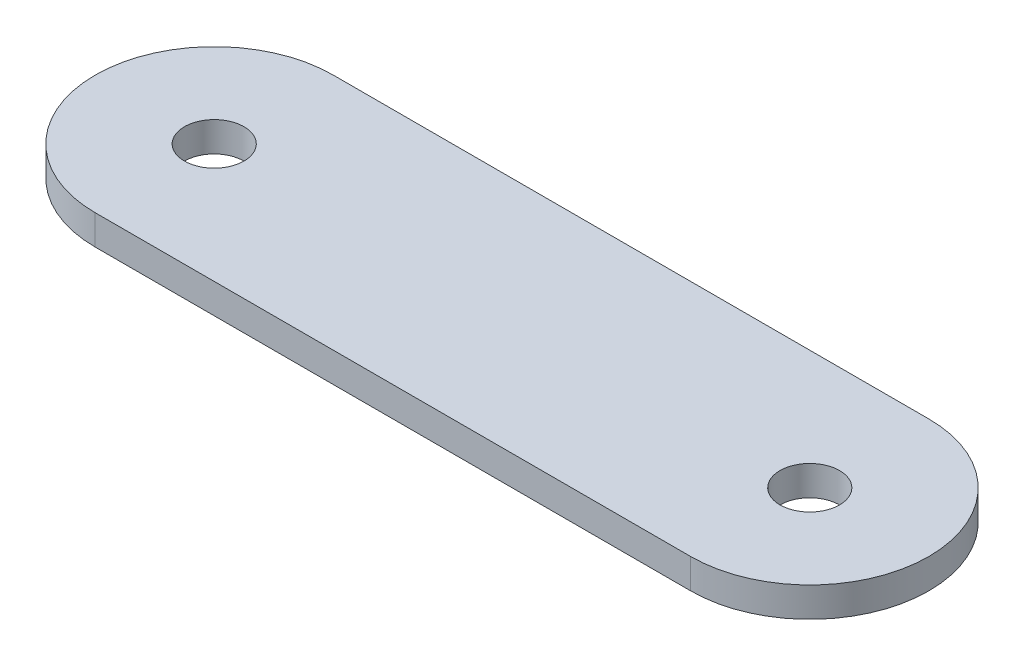
ISO-10303-21;
HEADER;
FILE_DESCRIPTION(('STEP AP214'),'2;1');
FILE_NAME('part.step','',(''),(''),'','','');
FILE_SCHEMA(('AUTOMOTIVE_DESIGN { 1 0 10303 214 1 1 1 1 }'));
ENDSEC;
DATA;
#1=APPLICATION_CONTEXT('core data for automotive mechanical design processes');
#2=APPLICATION_PROTOCOL_DEFINITION('international standard','automotive_design',2000,#1);
#3=PRODUCT_CONTEXT('',#1,'mechanical');
#4=PRODUCT('Part','Part','',(#3));
#5=PRODUCT_RELATED_PRODUCT_CATEGORY('part','',(#4));
#6=PRODUCT_DEFINITION_FORMATION('','',#4);
#7=PRODUCT_DEFINITION_CONTEXT('part definition',#1,'design');
#8=PRODUCT_DEFINITION('design','',#6,#7);
#9=PRODUCT_DEFINITION_SHAPE('','',#8);
#10=(LENGTH_UNIT() NAMED_UNIT(*) SI_UNIT(.MILLI.,.METRE.));
#11=(NAMED_UNIT(*) PLANE_ANGLE_UNIT() SI_UNIT($,.RADIAN.));
#12=(NAMED_UNIT(*) SI_UNIT($,.STERADIAN.) SOLID_ANGLE_UNIT());
#13=UNCERTAINTY_MEASURE_WITH_UNIT(LENGTH_MEASURE(1.E-05),#10,'distance_accuracy_value','');
#14=(GEOMETRIC_REPRESENTATION_CONTEXT(3) GLOBAL_UNCERTAINTY_ASSIGNED_CONTEXT((#13)) GLOBAL_UNIT_ASSIGNED_CONTEXT((#10,
#11,#12)) REPRESENTATION_CONTEXT('',''));
#15=CARTESIAN_POINT('',(0.,0.,0.));
#16=DIRECTION('',(0.,0.,1.));
#17=DIRECTION('',(1.,0.,0.));
#18=AXIS2_PLACEMENT_3D('',#15,#16,#17);
#19=CARTESIAN_POINT('',(15.875,1.5875,0.));
#20=DIRECTION('',(0.,1.,0.));
#21=DIRECTION('',(0.,0.,1.));
#22=AXIS2_PLACEMENT_3D('',#19,#20,#21);
#23=PLANE('',#22);
#24=CARTESIAN_POINT('',(-15.875,1.5875,0.));
#25=DIRECTION('',(0.,1.,0.));
#26=DIRECTION('',(0.,0.,1.));
#27=AXIS2_PLACEMENT_3D('',#24,#25,#26);
#28=CIRCLE('',#27,1.5875);
#29=CARTESIAN_POINT('',(-15.875,1.5875,1.5875));
#30=VERTEX_POINT('',#29);
#31=EDGE_CURVE('E100',#30,#30,#28,.T.);
#32=ORIENTED_EDGE('',*,*,#31,.F.);
#33=EDGE_LOOP('',(#32));
#34=FACE_BOUND('',#33,.T.);
#35=CARTESIAN_POINT('',(15.875,1.5875,0.));
#36=DIRECTION('',(0.,1.,0.));
#37=DIRECTION('',(0.,0.,1.));
#38=AXIS2_PLACEMENT_3D('',#35,#36,#37);
#39=CIRCLE('',#38,6.35);
#40=CARTESIAN_POINT('',(15.875,1.5875,6.34999999999999));
#41=VERTEX_POINT('',#40);
#42=CARTESIAN_POINT('',(15.875,1.5875,-6.35));
#43=VERTEX_POINT('',#42);
#44=EDGE_CURVE('E85',#41,#43,#39,.T.);
#45=ORIENTED_EDGE('',*,*,#44,.T.);
#46=DIRECTION('',(-1.,0.,0.));
#47=VECTOR('',#46,1.);
#48=CARTESIAN_POINT('',(15.875,1.5875,-6.35));
#49=LINE('',#48,#47);
#50=CARTESIAN_POINT('',(-15.875,1.5875,-6.34999999999999));
#51=VERTEX_POINT('',#50);
#52=EDGE_CURVE('E80',#43,#51,#49,.T.);
#53=ORIENTED_EDGE('',*,*,#52,.T.);
#54=CARTESIAN_POINT('',(-15.875,1.5875,0.));
#55=DIRECTION('',(0.,1.,0.));
#56=DIRECTION('',(0.,0.,1.));
#57=AXIS2_PLACEMENT_3D('',#54,#55,#56);
#58=CIRCLE('',#57,6.35);
#59=CARTESIAN_POINT('',(-15.875,1.5875,6.35));
#60=VERTEX_POINT('',#59);
#61=EDGE_CURVE('E83',#51,#60,#58,.T.);
#62=ORIENTED_EDGE('',*,*,#61,.T.);
#63=DIRECTION('',(1.,0.,0.));
#64=VECTOR('',#63,1.);
#65=CARTESIAN_POINT('',(15.875,1.5875,6.34999999999999));
#66=LINE('',#65,#64);
#67=EDGE_CURVE('E50',#60,#41,#66,.T.);
#68=ORIENTED_EDGE('',*,*,#67,.T.);
#69=EDGE_LOOP('',(#45,#53,#62,#68));
#70=FACE_BOUND('',#69,.T.);
#71=CARTESIAN_POINT('',(15.875,1.5875,0.));
#72=DIRECTION('',(0.,1.,0.));
#73=DIRECTION('',(0.,0.,1.));
#74=AXIS2_PLACEMENT_3D('',#71,#72,#73);
#75=CIRCLE('',#74,1.5875);
#76=CARTESIAN_POINT('',(15.875,1.5875,1.5875));
#77=VERTEX_POINT('',#76);
#78=EDGE_CURVE('E115',#77,#77,#75,.T.);
#79=ORIENTED_EDGE('',*,*,#78,.F.);
#80=EDGE_LOOP('',(#79));
#81=FACE_BOUND('',#80,.T.);
#82=ADVANCED_FACE('F33',(#34,#70,#81),#23,.T.);
#83=CARTESIAN_POINT('',(15.875,0.,0.));
#84=DIRECTION('',(0.,1.,0.));
#85=DIRECTION('',(0.,0.,1.));
#86=AXIS2_PLACEMENT_3D('',#83,#84,#85);
#87=PLANE('',#86);
#88=CARTESIAN_POINT('',(15.875,0.,0.));
#89=DIRECTION('',(0.,1.,0.));
#90=DIRECTION('',(0.,0.,1.));
#91=AXIS2_PLACEMENT_3D('',#88,#89,#90);
#92=CIRCLE('',#91,6.35);
#93=CARTESIAN_POINT('',(15.875,0.,6.34999999999999));
#94=VERTEX_POINT('',#93);
#95=CARTESIAN_POINT('',(15.875,0.,-6.35));
#96=VERTEX_POINT('',#95);
#97=EDGE_CURVE('E97',#94,#96,#92,.T.);
#98=ORIENTED_EDGE('',*,*,#97,.F.);
#99=DIRECTION('',(1.,0.,0.));
#100=VECTOR('',#99,1.);
#101=CARTESIAN_POINT('',(15.875,0.,6.34999999999999));
#102=LINE('',#101,#100);
#103=CARTESIAN_POINT('',(-15.875,0.,6.35));
#104=VERTEX_POINT('',#103);
#105=EDGE_CURVE('E73',#104,#94,#102,.T.);
#106=ORIENTED_EDGE('',*,*,#105,.F.);
#107=CARTESIAN_POINT('',(-15.875,0.,0.));
#108=DIRECTION('',(0.,1.,0.));
#109=DIRECTION('',(0.,0.,1.));
#110=AXIS2_PLACEMENT_3D('',#107,#108,#109);
#111=CIRCLE('',#110,6.35);
#112=CARTESIAN_POINT('',(-15.875,0.,-6.34999999999999));
#113=VERTEX_POINT('',#112);
#114=EDGE_CURVE('E67',#113,#104,#111,.T.);
#115=ORIENTED_EDGE('',*,*,#114,.F.);
#116=DIRECTION('',(-1.,0.,0.));
#117=VECTOR('',#116,1.);
#118=CARTESIAN_POINT('',(15.875,0.,-6.35));
#119=LINE('',#118,#117);
#120=EDGE_CURVE('E89',#96,#113,#119,.T.);
#121=ORIENTED_EDGE('',*,*,#120,.F.);
#122=EDGE_LOOP('',(#98,#106,#115,#121));
#123=FACE_BOUND('',#122,.T.);
#124=CARTESIAN_POINT('',(-15.875,0.,0.));
#125=DIRECTION('',(0.,1.,0.));
#126=DIRECTION('',(0.,0.,1.));
#127=AXIS2_PLACEMENT_3D('',#124,#125,#126);
#128=CIRCLE('',#127,1.5875);
#129=CARTESIAN_POINT('',(-15.875,0.,1.5875));
#130=VERTEX_POINT('',#129);
#131=EDGE_CURVE('E112',#130,#130,#128,.T.);
#132=ORIENTED_EDGE('',*,*,#131,.T.);
#133=EDGE_LOOP('',(#132));
#134=FACE_BOUND('',#133,.T.);
#135=CARTESIAN_POINT('',(15.875,0.,0.));
#136=DIRECTION('',(0.,1.,0.));
#137=DIRECTION('',(0.,0.,1.));
#138=AXIS2_PLACEMENT_3D('',#135,#136,#137);
#139=CIRCLE('',#138,1.5875);
#140=CARTESIAN_POINT('',(15.875,0.,1.5875));
#141=VERTEX_POINT('',#140);
#142=EDGE_CURVE('E118',#141,#141,#139,.T.);
#143=ORIENTED_EDGE('',*,*,#142,.T.);
#144=EDGE_LOOP('',(#143));
#145=FACE_BOUND('',#144,.T.);
#146=ADVANCED_FACE('F108',(#123,#134,#145),#87,.F.);
#147=CARTESIAN_POINT('',(15.875,1.5875,0.));
#148=DIRECTION('',(0.,-1.,0.));
#149=DIRECTION('',(0.,0.,-1.));
#150=AXIS2_PLACEMENT_3D('',#147,#148,#149);
#151=CYLINDRICAL_SURFACE('',#150,6.35);
#152=ORIENTED_EDGE('',*,*,#97,.T.);
#153=DIRECTION('',(0.,-1.,0.));
#154=VECTOR('',#153,1.);
#155=CARTESIAN_POINT('',(15.875,1.5875,-6.35));
#156=LINE('',#155,#154);
#157=EDGE_CURVE('E11',#43,#96,#156,.T.);
#158=ORIENTED_EDGE('',*,*,#157,.F.);
#159=ORIENTED_EDGE('',*,*,#44,.F.);
#160=DIRECTION('',(0.,-1.,0.));
#161=VECTOR('',#160,1.);
#162=CARTESIAN_POINT('',(15.875,1.5875,6.34999999999999));
#163=LINE('',#162,#161);
#164=EDGE_CURVE('E93',#41,#94,#163,.T.);
#165=ORIENTED_EDGE('',*,*,#164,.T.);
#166=EDGE_LOOP('',(#152,#158,#159,#165));
#167=FACE_BOUND('',#166,.T.);
#168=ADVANCED_FACE('F35',(#167),#151,.T.);
#169=CARTESIAN_POINT('',(15.875,1.5875,-6.35));
#170=DIRECTION('',(0.,0.,1.));
#171=DIRECTION('',(1.,0.,0.));
#172=AXIS2_PLACEMENT_3D('',#169,#170,#171);
#173=PLANE('',#172);
#174=ORIENTED_EDGE('',*,*,#120,.T.);
#175=DIRECTION('',(0.,-1.,0.));
#176=VECTOR('',#175,1.);
#177=CARTESIAN_POINT('',(-15.875,1.5875,-6.34999999999999));
#178=LINE('',#177,#176);
#179=EDGE_CURVE('E42',#51,#113,#178,.T.);
#180=ORIENTED_EDGE('',*,*,#179,.F.);
#181=ORIENTED_EDGE('',*,*,#52,.F.);
#182=ORIENTED_EDGE('',*,*,#157,.T.);
#183=EDGE_LOOP('',(#174,#180,#181,#182));
#184=FACE_BOUND('',#183,.T.);
#185=ADVANCED_FACE('F88',(#184),#173,.F.);
#186=CARTESIAN_POINT('',(-15.875,1.5875,0.));
#187=DIRECTION('',(0.,-1.,0.));
#188=DIRECTION('',(0.,0.,-1.));
#189=AXIS2_PLACEMENT_3D('',#186,#187,#188);
#190=CYLINDRICAL_SURFACE('',#189,6.35);
#191=ORIENTED_EDGE('',*,*,#114,.T.);
#192=DIRECTION('',(0.,-1.,0.));
#193=VECTOR('',#192,1.);
#194=CARTESIAN_POINT('',(-15.875,1.5875,6.35));
#195=LINE('',#194,#193);
#196=EDGE_CURVE('E90',#60,#104,#195,.T.);
#197=ORIENTED_EDGE('',*,*,#196,.F.);
#198=ORIENTED_EDGE('',*,*,#61,.F.);
#199=ORIENTED_EDGE('',*,*,#179,.T.);
#200=EDGE_LOOP('',(#191,#197,#198,#199));
#201=FACE_BOUND('',#200,.T.);
#202=ADVANCED_FACE('F91',(#201),#190,.T.);
#203=CARTESIAN_POINT('',(15.875,1.5875,6.34999999999999));
#204=DIRECTION('',(0.,0.,-1.));
#205=DIRECTION('',(-1.,0.,0.));
#206=AXIS2_PLACEMENT_3D('',#203,#204,#205);
#207=PLANE('',#206);
#208=ORIENTED_EDGE('',*,*,#105,.T.);
#209=ORIENTED_EDGE('',*,*,#164,.F.);
#210=ORIENTED_EDGE('',*,*,#67,.F.);
#211=ORIENTED_EDGE('',*,*,#196,.T.);
#212=EDGE_LOOP('',(#208,#209,#210,#211));
#213=FACE_BOUND('',#212,.T.);
#214=ADVANCED_FACE('F105',(#213),#207,.F.);
#215=CARTESIAN_POINT('',(-15.875,1.5875,0.));
#216=DIRECTION('',(0.,-1.,0.));
#217=DIRECTION('',(0.,0.,-1.));
#218=AXIS2_PLACEMENT_3D('',#215,#216,#217);
#219=CYLINDRICAL_SURFACE('',#218,1.5875);
#220=ORIENTED_EDGE('',*,*,#31,.T.);
#221=EDGE_LOOP('',(#220));
#222=FACE_BOUND('',#221,.T.);
#223=ORIENTED_EDGE('',*,*,#131,.F.);
#224=EDGE_LOOP('',(#223));
#225=FACE_BOUND('',#224,.T.);
#226=ADVANCED_FACE('F135',(#222,#225),#219,.F.);
#227=CARTESIAN_POINT('',(15.875,1.5875,0.));
#228=DIRECTION('',(0.,-1.,0.));
#229=DIRECTION('',(0.,0.,-1.));
#230=AXIS2_PLACEMENT_3D('',#227,#228,#229);
#231=CYLINDRICAL_SURFACE('',#230,1.5875);
#232=ORIENTED_EDGE('',*,*,#78,.T.);
#233=EDGE_LOOP('',(#232));
#234=FACE_BOUND('',#233,.T.);
#235=ORIENTED_EDGE('',*,*,#142,.F.);
#236=EDGE_LOOP('',(#235));
#237=FACE_BOUND('',#236,.T.);
#238=ADVANCED_FACE('F124',(#234,#237),#231,.F.);
#239=CLOSED_SHELL('',(#82,#146,#168,#185,#202,#214,#226,#238));
#240=MANIFOLD_SOLID_BREP('B2',#239);
#241=ADVANCED_BREP_SHAPE_REPRESENTATION('',(#18,#240),#14);
#242=SHAPE_DEFINITION_REPRESENTATION(#9,#241);
ENDSEC;
END-ISO-10303-21;
